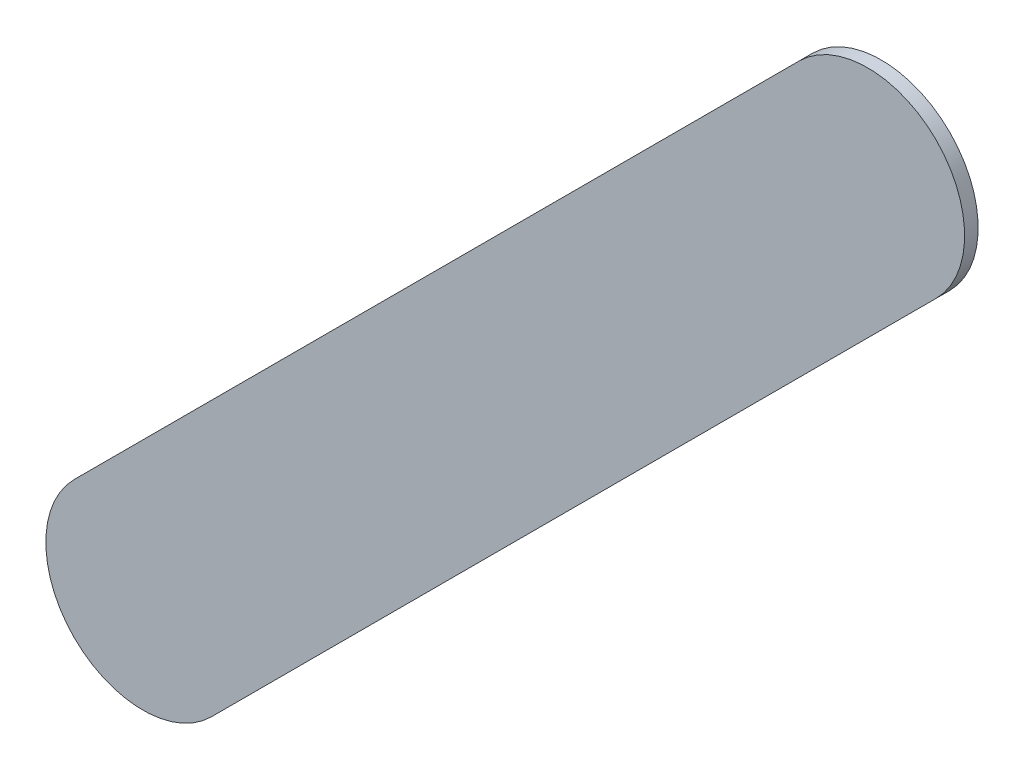
ISO-10303-21;
HEADER;
FILE_DESCRIPTION(('STEP AP214'),'2;1');
FILE_NAME('part.step','',(''),(''),'','','');
FILE_SCHEMA(('AUTOMOTIVE_DESIGN { 1 0 10303 214 1 1 1 1 }'));
ENDSEC;
DATA;
#1=APPLICATION_CONTEXT('core data for automotive mechanical design processes');
#2=APPLICATION_PROTOCOL_DEFINITION('international standard','automotive_design',2000,#1);
#3=PRODUCT_CONTEXT('',#1,'mechanical');
#4=PRODUCT('Part','Part','',(#3));
#5=PRODUCT_RELATED_PRODUCT_CATEGORY('part','',(#4));
#6=PRODUCT_DEFINITION_FORMATION('','',#4);
#7=PRODUCT_DEFINITION_CONTEXT('part definition',#1,'design');
#8=PRODUCT_DEFINITION('design','',#6,#7);
#9=PRODUCT_DEFINITION_SHAPE('','',#8);
#10=(LENGTH_UNIT() NAMED_UNIT(*) SI_UNIT(.MILLI.,.METRE.));
#11=(NAMED_UNIT(*) PLANE_ANGLE_UNIT() SI_UNIT($,.RADIAN.));
#12=(NAMED_UNIT(*) SI_UNIT($,.STERADIAN.) SOLID_ANGLE_UNIT());
#13=UNCERTAINTY_MEASURE_WITH_UNIT(LENGTH_MEASURE(1.E-05),#10,'distance_accuracy_value','');
#14=(GEOMETRIC_REPRESENTATION_CONTEXT(3) GLOBAL_UNCERTAINTY_ASSIGNED_CONTEXT((#13)) GLOBAL_UNIT_ASSIGNED_CONTEXT((#10,
#11,#12)) REPRESENTATION_CONTEXT('',''));
#15=CARTESIAN_POINT('',(0.,0.,0.));
#16=DIRECTION('',(0.,0.,1.));
#17=DIRECTION('',(1.,0.,0.));
#18=AXIS2_PLACEMENT_3D('',#15,#16,#17);
#19=CARTESIAN_POINT('',(89.726776,-86.746776,1.635));
#20=DIRECTION('',(0.,0.,1.));
#21=DIRECTION('',(1.,0.,0.));
#22=AXIS2_PLACEMENT_3D('',#19,#20,#21);
#23=PLANE('',#22);
#24=DIRECTION('',(0.707106781186548,0.707106781186548,0.));
#25=VECTOR('',#24,1.);
#26=CARTESIAN_POINT('',(89.726776,-86.746776,1.635));
#27=LINE('',#26,#25);
#28=CARTESIAN_POINT('',(89.726776,-86.746776,1.635));
#29=VERTEX_POINT('',#28);
#30=CARTESIAN_POINT('',(91.596776,-84.876776,1.635));
#31=VERTEX_POINT('',#30);
#32=EDGE_CURVE('E93',#29,#31,#27,.T.);
#33=ORIENTED_EDGE('',*,*,#32,.T.);
#34=CARTESIAN_POINT('',(91.4199995,-84.6999995,1.635));
#35=DIRECTION('',(0.,0.,1.));
#36=DIRECTION('',(0.707106781186548,-0.707106781186548,0.));
#37=AXIS2_PLACEMENT_3D('',#34,#35,#36);
#38=CIRCLE('',#37,0.249999723809);
#39=CARTESIAN_POINT('',(91.243223,-84.523223,1.635));
#40=VERTEX_POINT('',#39);
#41=EDGE_CURVE('E75',#31,#40,#38,.T.);
#42=ORIENTED_EDGE('',*,*,#41,.T.);
#43=DIRECTION('',(-0.707106781186548,-0.707106781186548,0.));
#44=VECTOR('',#43,1.);
#45=CARTESIAN_POINT('',(91.243223,-84.523223,1.635));
#46=LINE('',#45,#44);
#47=CARTESIAN_POINT('',(89.373223,-86.393223,1.635));
#48=VERTEX_POINT('',#47);
#49=EDGE_CURVE('E87',#40,#48,#46,.T.);
#50=ORIENTED_EDGE('',*,*,#49,.T.);
#51=CARTESIAN_POINT('',(89.5499995,-86.5699995,1.635));
#52=DIRECTION('',(0.,0.,1.));
#53=DIRECTION('',(-0.707106781186548,0.707106781186548,0.));
#54=AXIS2_PLACEMENT_3D('',#51,#52,#53);
#55=CIRCLE('',#54,0.249999723809);
#56=EDGE_CURVE('E11',#48,#29,#55,.T.);
#57=ORIENTED_EDGE('',*,*,#56,.T.);
#58=EDGE_LOOP('',(#33,#42,#50,#57));
#59=FACE_BOUND('',#58,.T.);
#60=ADVANCED_FACE('F17',(#59),#23,.T.);
#61=CARTESIAN_POINT('',(89.726776,-86.746776,1.6));
#62=DIRECTION('',(0.,0.,1.));
#63=DIRECTION('',(1.,0.,0.));
#64=AXIS2_PLACEMENT_3D('',#61,#62,#63);
#65=PLANE('',#64);
#66=CARTESIAN_POINT('',(89.5499995,-86.5699995,1.6));
#67=DIRECTION('',(0.,0.,1.));
#68=DIRECTION('',(-0.707106781186548,0.707106781186548,0.));
#69=AXIS2_PLACEMENT_3D('',#66,#67,#68);
#70=CIRCLE('',#69,0.249999723809);
#71=CARTESIAN_POINT('',(89.373223,-86.393223,1.6));
#72=VERTEX_POINT('',#71);
#73=CARTESIAN_POINT('',(89.726776,-86.746776,1.6));
#74=VERTEX_POINT('',#73);
#75=EDGE_CURVE('E26',#72,#74,#70,.T.);
#76=ORIENTED_EDGE('',*,*,#75,.F.);
#77=DIRECTION('',(-0.707106781186548,-0.707106781186548,0.));
#78=VECTOR('',#77,1.);
#79=CARTESIAN_POINT('',(91.243223,-84.523223,1.6));
#80=LINE('',#79,#78);
#81=CARTESIAN_POINT('',(91.243223,-84.523223,1.6));
#82=VERTEX_POINT('',#81);
#83=EDGE_CURVE('E58',#82,#72,#80,.T.);
#84=ORIENTED_EDGE('',*,*,#83,.F.);
#85=CARTESIAN_POINT('',(91.4199995,-84.6999995,1.6));
#86=DIRECTION('',(0.,0.,1.));
#87=DIRECTION('',(0.707106781186548,-0.707106781186548,0.));
#88=AXIS2_PLACEMENT_3D('',#85,#86,#87);
#89=CIRCLE('',#88,0.249999723809);
#90=CARTESIAN_POINT('',(91.596776,-84.876776,1.6));
#91=VERTEX_POINT('',#90);
#92=EDGE_CURVE('E95',#91,#82,#89,.T.);
#93=ORIENTED_EDGE('',*,*,#92,.F.);
#94=DIRECTION('',(0.707106781186548,0.707106781186548,0.));
#95=VECTOR('',#94,1.);
#96=CARTESIAN_POINT('',(89.726776,-86.746776,1.6));
#97=LINE('',#96,#95);
#98=EDGE_CURVE('E92',#74,#91,#97,.T.);
#99=ORIENTED_EDGE('',*,*,#98,.F.);
#100=EDGE_LOOP('',(#76,#84,#93,#99));
#101=FACE_BOUND('',#100,.T.);
#102=ADVANCED_FACE('F19',(#101),#65,.F.);
#103=CARTESIAN_POINT('',(89.5499995,-86.5699995,1.6));
#104=DIRECTION('',(0.,0.,-1.));
#105=DIRECTION('',(-0.707106781186548,0.707106781186548,0.));
#106=AXIS2_PLACEMENT_3D('',#103,#104,#105);
#107=CYLINDRICAL_SURFACE('',#106,0.249999723809);
#108=ORIENTED_EDGE('',*,*,#75,.T.);
#109=DIRECTION('',(0.,0.,1.));
#110=VECTOR('',#109,1.);
#111=CARTESIAN_POINT('',(89.726776,-86.746776,1.6));
#112=LINE('',#111,#110);
#113=EDGE_CURVE('E82',#74,#29,#112,.T.);
#114=ORIENTED_EDGE('',*,*,#113,.T.);
#115=ORIENTED_EDGE('',*,*,#56,.F.);
#116=DIRECTION('',(0.,0.,1.));
#117=VECTOR('',#116,1.);
#118=CARTESIAN_POINT('',(89.373223,-86.393223,1.6));
#119=LINE('',#118,#117);
#120=EDGE_CURVE('E85',#72,#48,#119,.T.);
#121=ORIENTED_EDGE('',*,*,#120,.F.);
#122=EDGE_LOOP('',(#108,#114,#115,#121));
#123=FACE_BOUND('',#122,.T.);
#124=ADVANCED_FACE('F81',(#123),#107,.T.);
#125=CARTESIAN_POINT('',(91.243223,-84.523223,1.6));
#126=DIRECTION('',(0.707106781186548,-0.707106781186548,0.));
#127=DIRECTION('',(0.,0.,-1.));
#128=AXIS2_PLACEMENT_3D('',#125,#126,#127);
#129=PLANE('',#128);
#130=ORIENTED_EDGE('',*,*,#83,.T.);
#131=ORIENTED_EDGE('',*,*,#120,.T.);
#132=ORIENTED_EDGE('',*,*,#49,.F.);
#133=DIRECTION('',(0.,0.,1.));
#134=VECTOR('',#133,1.);
#135=CARTESIAN_POINT('',(91.243223,-84.523223,1.6));
#136=LINE('',#135,#134);
#137=EDGE_CURVE('E111',#82,#40,#136,.T.);
#138=ORIENTED_EDGE('',*,*,#137,.F.);
#139=EDGE_LOOP('',(#130,#131,#132,#138));
#140=FACE_BOUND('',#139,.T.);
#141=ADVANCED_FACE('F124',(#140),#129,.F.);
#142=CARTESIAN_POINT('',(91.4199995,-84.6999995,1.6));
#143=DIRECTION('',(0.,0.,-1.));
#144=DIRECTION('',(0.707106781186548,-0.707106781186548,0.));
#145=AXIS2_PLACEMENT_3D('',#142,#143,#144);
#146=CYLINDRICAL_SURFACE('',#145,0.249999723809);
#147=ORIENTED_EDGE('',*,*,#92,.T.);
#148=ORIENTED_EDGE('',*,*,#137,.T.);
#149=ORIENTED_EDGE('',*,*,#41,.F.);
#150=DIRECTION('',(0.,0.,1.));
#151=VECTOR('',#150,1.);
#152=CARTESIAN_POINT('',(91.596776,-84.876776,1.6));
#153=LINE('',#152,#151);
#154=EDGE_CURVE('E99',#91,#31,#153,.T.);
#155=ORIENTED_EDGE('',*,*,#154,.F.);
#156=EDGE_LOOP('',(#147,#148,#149,#155));
#157=FACE_BOUND('',#156,.T.);
#158=ADVANCED_FACE('F125',(#157),#146,.T.);
#159=CARTESIAN_POINT('',(89.726776,-86.746776,1.6));
#160=DIRECTION('',(-0.707106781186548,0.707106781186548,0.));
#161=DIRECTION('',(0.,0.,1.));
#162=AXIS2_PLACEMENT_3D('',#159,#160,#161);
#163=PLANE('',#162);
#164=ORIENTED_EDGE('',*,*,#98,.T.);
#165=ORIENTED_EDGE('',*,*,#154,.T.);
#166=ORIENTED_EDGE('',*,*,#32,.F.);
#167=ORIENTED_EDGE('',*,*,#113,.F.);
#168=EDGE_LOOP('',(#164,#165,#166,#167));
#169=FACE_BOUND('',#168,.T.);
#170=ADVANCED_FACE('F90',(#169),#163,.F.);
#171=CLOSED_SHELL('',(#60,#102,#124,#141,#158,#170));
#172=MANIFOLD_SOLID_BREP('B1',#171);
#173=ADVANCED_BREP_SHAPE_REPRESENTATION('',(#18,#172),#14);
#174=SHAPE_DEFINITION_REPRESENTATION(#9,#173);
ENDSEC;
END-ISO-10303-21;
